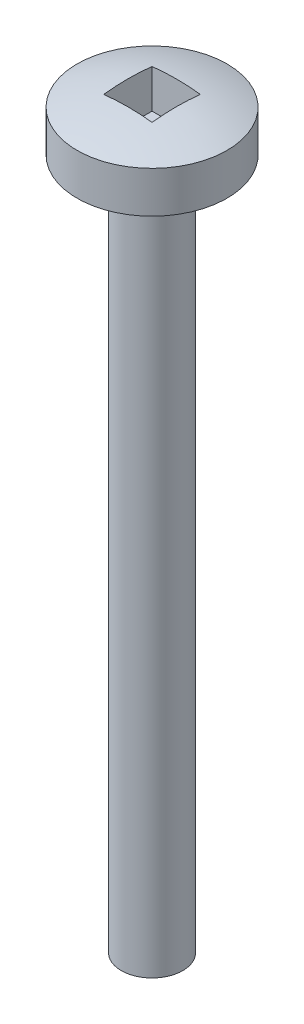
ISO-10303-21;
HEADER;
FILE_DESCRIPTION(('STEP AP214'),'2;1');
FILE_NAME('part.step','',(''),(''),'','','');
FILE_SCHEMA(('AUTOMOTIVE_DESIGN { 1 0 10303 214 1 1 1 1 }'));
ENDSEC;
DATA;
#1=APPLICATION_CONTEXT('core data for automotive mechanical design processes');
#2=APPLICATION_PROTOCOL_DEFINITION('international standard','automotive_design',2000,#1);
#3=PRODUCT_CONTEXT('',#1,'mechanical');
#4=PRODUCT('Part','Part','',(#3));
#5=PRODUCT_RELATED_PRODUCT_CATEGORY('part','',(#4));
#6=PRODUCT_DEFINITION_FORMATION('','',#4);
#7=PRODUCT_DEFINITION_CONTEXT('part definition',#1,'design');
#8=PRODUCT_DEFINITION('design','',#6,#7);
#9=PRODUCT_DEFINITION_SHAPE('','',#8);
#10=(LENGTH_UNIT() NAMED_UNIT(*) SI_UNIT(.MILLI.,.METRE.));
#11=(NAMED_UNIT(*) PLANE_ANGLE_UNIT() SI_UNIT($,.RADIAN.));
#12=(NAMED_UNIT(*) SI_UNIT($,.STERADIAN.) SOLID_ANGLE_UNIT());
#13=UNCERTAINTY_MEASURE_WITH_UNIT(LENGTH_MEASURE(1.E-05),#10,'distance_accuracy_value','');
#14=(GEOMETRIC_REPRESENTATION_CONTEXT(3) GLOBAL_UNCERTAINTY_ASSIGNED_CONTEXT((#13)) GLOBAL_UNIT_ASSIGNED_CONTEXT((#10,
#11,#12)) REPRESENTATION_CONTEXT('',''));
#15=CARTESIAN_POINT('',(0.,0.,0.));
#16=DIRECTION('',(0.,0.,1.));
#17=DIRECTION('',(1.,0.,0.));
#18=AXIS2_PLACEMENT_3D('',#15,#16,#17);
#19=CARTESIAN_POINT('',(0.,-25.4,0.));
#20=DIRECTION('',(0.,1.,0.));
#21=DIRECTION('',(0.,0.,1.));
#22=AXIS2_PLACEMENT_3D('',#19,#20,#21);
#23=CYLINDRICAL_SURFACE('',#22,1.1303);
#24=CARTESIAN_POINT('',(0.,-25.4,0.));
#25=DIRECTION('',(0.,1.,0.));
#26=DIRECTION('',(0.,0.,1.));
#27=AXIS2_PLACEMENT_3D('',#24,#25,#26);
#28=CIRCLE('',#27,1.1303);
#29=CARTESIAN_POINT('',(0.,-25.4,1.1303));
#30=VERTEX_POINT('',#29);
#31=EDGE_CURVE('E105',#30,#30,#28,.T.);
#32=ORIENTED_EDGE('',*,*,#31,.T.);
#33=EDGE_LOOP('',(#32));
#34=FACE_BOUND('',#33,.T.);
#35=CARTESIAN_POINT('',(0.,0.,0.));
#36=DIRECTION('',(0.,1.,0.));
#37=DIRECTION('',(0.,0.,1.));
#38=AXIS2_PLACEMENT_3D('',#35,#36,#37);
#39=CIRCLE('',#38,1.1303);
#40=CARTESIAN_POINT('',(0.,0.,1.1303));
#41=VERTEX_POINT('',#40);
#42=EDGE_CURVE('E109',#41,#41,#39,.T.);
#43=ORIENTED_EDGE('',*,*,#42,.F.);
#44=EDGE_LOOP('',(#43));
#45=FACE_BOUND('',#44,.T.);
#46=ADVANCED_FACE('F33',(#34,#45),#23,.T.);
#47=CARTESIAN_POINT('',(0.,-25.4,0.));
#48=DIRECTION('',(0.,1.,0.));
#49=DIRECTION('',(0.,0.,1.));
#50=AXIS2_PLACEMENT_3D('',#47,#48,#49);
#51=PLANE('',#50);
#52=ORIENTED_EDGE('',*,*,#31,.F.);
#53=EDGE_LOOP('',(#52));
#54=FACE_BOUND('',#53,.T.);
#55=ADVANCED_FACE('F129',(#54),#51,.F.);
#56=CARTESIAN_POINT('',(0.,1.524,0.));
#57=DIRECTION('',(0.,-1.,0.));
#58=DIRECTION('',(0.,0.,-1.));
#59=AXIS2_PLACEMENT_3D('',#56,#57,#58);
#60=CYLINDRICAL_SURFACE('',#59,2.7559);
#61=CARTESIAN_POINT('',(0.,1.524,0.));
#62=DIRECTION('',(0.,1.,0.));
#63=DIRECTION('',(0.,0.,1.));
#64=AXIS2_PLACEMENT_3D('',#61,#62,#63);
#65=CIRCLE('',#64,2.7559);
#66=CARTESIAN_POINT('',(0.,1.524,-2.7559));
#67=VERTEX_POINT('',#66);
#68=EDGE_CURVE('E104',#67,#67,#65,.T.);
#69=CARTESIAN_POINT('',(0.,0.,0.));
#70=DIRECTION('',(0.,1.,0.));
#71=DIRECTION('',(0.,0.,1.));
#72=AXIS2_PLACEMENT_3D('',#69,#70,#71);
#73=CIRCLE('',#72,2.7559);
#74=CARTESIAN_POINT('',(0.,0.,-2.7559));
#75=VERTEX_POINT('',#74);
#76=EDGE_CURVE('E98',#75,#75,#73,.T.);
#77=CARTESIAN_POINT('',(0.,1.524,-2.7559));
#78=CARTESIAN_POINT('',(0.,1.508125,-2.7559));
#79=CARTESIAN_POINT('',(0.,1.49225,-2.7559));
#80=CARTESIAN_POINT('',(0.,1.4605,-2.7559));
#81=CARTESIAN_POINT('',(0.,1.444625,-2.7559));
#82=CARTESIAN_POINT('',(0.,1.412875,-2.7559));
#83=CARTESIAN_POINT('',(0.,1.397,-2.7559));
#84=CARTESIAN_POINT('',(0.,1.36525,-2.7559));
#85=CARTESIAN_POINT('',(0.,1.349375,-2.7559));
#86=CARTESIAN_POINT('',(0.,1.317625,-2.7559));
#87=CARTESIAN_POINT('',(0.,1.30175,-2.7559));
#88=CARTESIAN_POINT('',(0.,1.27,-2.7559));
#89=CARTESIAN_POINT('',(0.,1.254125,-2.7559));
#90=CARTESIAN_POINT('',(0.,1.222375,-2.7559));
#91=CARTESIAN_POINT('',(0.,1.2065,-2.7559));
#92=CARTESIAN_POINT('',(0.,1.17475,-2.7559));
#93=CARTESIAN_POINT('',(0.,1.158875,-2.7559));
#94=CARTESIAN_POINT('',(0.,1.127125,-2.7559));
#95=CARTESIAN_POINT('',(0.,1.11125,-2.7559));
#96=CARTESIAN_POINT('',(0.,1.0795,-2.7559));
#97=CARTESIAN_POINT('',(0.,1.063625,-2.7559));
#98=CARTESIAN_POINT('',(0.,1.031875,-2.7559));
#99=CARTESIAN_POINT('',(0.,1.016,-2.7559));
#100=CARTESIAN_POINT('',(0.,0.98425,-2.7559));
#101=CARTESIAN_POINT('',(0.,0.968375,-2.7559));
#102=CARTESIAN_POINT('',(0.,0.936625,-2.7559));
#103=CARTESIAN_POINT('',(0.,0.92075,-2.7559));
#104=CARTESIAN_POINT('',(0.,0.889,-2.7559));
#105=CARTESIAN_POINT('',(0.,0.873125,-2.7559));
#106=CARTESIAN_POINT('',(0.,0.841375,-2.7559));
#107=CARTESIAN_POINT('',(0.,0.8255,-2.7559));
#108=CARTESIAN_POINT('',(0.,0.79375,-2.7559));
#109=CARTESIAN_POINT('',(0.,0.777875,-2.7559));
#110=CARTESIAN_POINT('',(0.,0.746125,-2.7559));
#111=CARTESIAN_POINT('',(0.,0.73025,-2.7559));
#112=CARTESIAN_POINT('',(0.,0.6985,-2.7559));
#113=CARTESIAN_POINT('',(0.,0.682625,-2.7559));
#114=CARTESIAN_POINT('',(0.,0.650875,-2.7559));
#115=CARTESIAN_POINT('',(0.,0.635,-2.7559));
#116=CARTESIAN_POINT('',(0.,0.60325,-2.7559));
#117=CARTESIAN_POINT('',(0.,0.587375,-2.7559));
#118=CARTESIAN_POINT('',(0.,0.555625,-2.7559));
#119=CARTESIAN_POINT('',(0.,0.53975,-2.7559));
#120=CARTESIAN_POINT('',(0.,0.508,-2.7559));
#121=CARTESIAN_POINT('',(0.,0.492125,-2.7559));
#122=CARTESIAN_POINT('',(0.,0.460375,-2.7559));
#123=CARTESIAN_POINT('',(0.,0.4445,-2.7559));
#124=CARTESIAN_POINT('',(0.,0.41275,-2.7559));
#125=CARTESIAN_POINT('',(0.,0.396875,-2.7559));
#126=CARTESIAN_POINT('',(0.,0.365125,-2.7559));
#127=CARTESIAN_POINT('',(0.,0.34925,-2.7559));
#128=CARTESIAN_POINT('',(0.,0.3175,-2.7559));
#129=CARTESIAN_POINT('',(0.,0.301625,-2.7559));
#130=CARTESIAN_POINT('',(0.,0.269875,-2.7559));
#131=CARTESIAN_POINT('',(0.,0.254,-2.7559));
#132=CARTESIAN_POINT('',(0.,0.22225,-2.7559));
#133=CARTESIAN_POINT('',(0.,0.206375,-2.7559));
#134=CARTESIAN_POINT('',(0.,0.174625,-2.7559));
#135=CARTESIAN_POINT('',(0.,0.15875,-2.7559));
#136=CARTESIAN_POINT('',(0.,0.127,-2.7559));
#137=CARTESIAN_POINT('',(0.,0.111125,-2.7559));
#138=CARTESIAN_POINT('',(0.,0.079375,-2.7559));
#139=CARTESIAN_POINT('',(0.,0.0635,-2.7559));
#140=CARTESIAN_POINT('',(0.,0.0317499999999999,-2.7559));
#141=CARTESIAN_POINT('',(0.,0.015875,-2.7559));
#142=CARTESIAN_POINT('',(0.,0.,-2.7559));
#143=B_SPLINE_CURVE_WITH_KNOTS('',3,(#77,#78,#79,#80,#81,#82,#83,#84,#85,#86,#87,#88,#89,#90,
#91,#92,#93,#94,#95,#96,#97,#98,#99,#100,#101,#102,#103,#104,#105,#106,#107,#108,#109,#110,#111,
#112,#113,#114,#115,#116,#117,#118,#119,#120,#121,#122,#123,#124,#125,#126,#127,#128,#129,#130,
#131,#132,#133,#134,#135,#136,#137,#138,#139,#140,#141,#142),.UNSPECIFIED.,.F.,.F.,(4,2,2,2,2,2,
2,2,2,2,2,2,2,2,2,2,2,2,2,2,2,2,2,2,2,2,2,2,2,2,2,2,4),(0.,0.0476250000000001,
0.0952500000000001,0.142875,0.1905,0.238125,0.28575,0.333375,0.381,0.428625,0.47625,0.523875,
0.5715,0.619125,0.66675,0.714375,0.762,0.809625,0.85725,0.904875,0.9525,1.000125,1.04775,
1.095375,1.143,1.190625,1.23825,1.285875,1.3335,1.381125,1.42875,1.476375,1.524),.UNSPECIFIED.);
#144=EDGE_CURVE('BSEAM124',#67,#75,#143,.T.);
#145=ORIENTED_EDGE('',*,*,#68,.F.);
#146=ORIENTED_EDGE('',*,*,#76,.T.);
#147=ORIENTED_EDGE('',*,*,#144,.T.);
#148=ORIENTED_EDGE('',*,*,#144,.F.);
#149=EDGE_LOOP('',(#145,#147,#146,#148));
#150=FACE_BOUND('',#149,.T.);
#151=ADVANCED_FACE('F124',(#150),#60,.T.);
#152=CARTESIAN_POINT('',(0.,-5.69737875,0.));
#153=DIRECTION('',(0.,0.,1.));
#154=DIRECTION('',(1.,0.,0.));
#155=AXIS2_PLACEMENT_3D('',#152,#153,#154);
#156=SPHERICAL_SURFACE('',#155,7.72937875);
#157=CARTESIAN_POINT('',(0.889,-5.69737875,0.));
#158=DIRECTION('',(1.,0.,0.));
#159=DIRECTION('',(0.,0.,-1.));
#160=AXIS2_PLACEMENT_3D('',#157,#158,#159);
#161=CIRCLE('',#160,7.67808406185759);
#162=CARTESIAN_POINT('',(0.889,1.92906562867028,0.889));
#163=VERTEX_POINT('',#162);
#164=CARTESIAN_POINT('',(0.889,1.92906562867028,-0.889));
#165=VERTEX_POINT('',#164);
#166=EDGE_CURVE('E11',#163,#165,#161,.F.);
#167=ORIENTED_EDGE('',*,*,#166,.F.);
#168=CARTESIAN_POINT('',(0.,-5.69737875,0.889));
#169=DIRECTION('',(0.,0.,1.));
#170=DIRECTION('',(1.,0.,0.));
#171=AXIS2_PLACEMENT_3D('',#168,#169,#170);
#172=CIRCLE('',#171,7.67808406185759);
#173=CARTESIAN_POINT('',(-0.889,1.92906562867028,0.888999999999999));
#174=VERTEX_POINT('',#173);
#175=EDGE_CURVE('E41',#174,#163,#172,.F.);
#176=ORIENTED_EDGE('',*,*,#175,.F.);
#177=CARTESIAN_POINT('',(-0.889,-5.69737875,0.));
#178=DIRECTION('',(-1.,0.,0.));
#179=DIRECTION('',(0.,0.,1.));
#180=AXIS2_PLACEMENT_3D('',#177,#178,#179);
#181=CIRCLE('',#180,7.67808406185759);
#182=CARTESIAN_POINT('',(-0.888999999999999,1.92906562867028,-0.889));
#183=VERTEX_POINT('',#182);
#184=EDGE_CURVE('E115',#183,#174,#181,.F.);
#185=ORIENTED_EDGE('',*,*,#184,.F.);
#186=CARTESIAN_POINT('',(0.,-5.69737875,-0.889));
#187=DIRECTION('',(0.,0.,-1.));
#188=DIRECTION('',(-1.,0.,0.));
#189=AXIS2_PLACEMENT_3D('',#186,#187,#188);
#190=CIRCLE('',#189,7.67808406185759);
#191=EDGE_CURVE('E108',#165,#183,#190,.F.);
#192=ORIENTED_EDGE('',*,*,#191,.F.);
#193=EDGE_LOOP('',(#167,#176,#185,#192));
#194=FACE_BOUND('',#193,.T.);
#195=ORIENTED_EDGE('',*,*,#68,.T.);
#196=EDGE_LOOP('',(#195));
#197=FACE_BOUND('',#196,.T.);
#198=ADVANCED_FACE('F35',(#194,#197),#156,.T.);
#199=CARTESIAN_POINT('',(0.,0.,0.));
#200=DIRECTION('',(0.,1.,0.));
#201=DIRECTION('',(0.,0.,1.));
#202=AXIS2_PLACEMENT_3D('',#199,#200,#201);
#203=PLANE('',#202);
#204=ORIENTED_EDGE('',*,*,#42,.T.);
#205=EDGE_LOOP('',(#204));
#206=FACE_BOUND('',#205,.T.);
#207=ORIENTED_EDGE('',*,*,#76,.F.);
#208=EDGE_LOOP('',(#207));
#209=FACE_BOUND('',#208,.T.);
#210=ADVANCED_FACE('F123',(#206,#209),#203,.F.);
#211=CARTESIAN_POINT('',(0.889,0.508,0.889));
#212=DIRECTION('',(1.,0.,0.));
#213=DIRECTION('',(0.,0.,-1.));
#214=AXIS2_PLACEMENT_3D('',#211,#212,#213);
#215=PLANE('',#214);
#216=ORIENTED_EDGE('',*,*,#166,.T.);
#217=DIRECTION('',(0.,1.,0.));
#218=VECTOR('',#217,1.);
#219=CARTESIAN_POINT('',(0.889,0.508,-0.889));
#220=LINE('',#219,#218);
#221=CARTESIAN_POINT('',(0.889,0.508,-0.889));
#222=VERTEX_POINT('',#221);
#223=EDGE_CURVE('E48',#222,#165,#220,.T.);
#224=ORIENTED_EDGE('',*,*,#223,.F.);
#225=DIRECTION('',(0.,0.,-1.));
#226=VECTOR('',#225,1.);
#227=CARTESIAN_POINT('',(0.889,0.508,0.889));
#228=LINE('',#227,#226);
#229=CARTESIAN_POINT('',(0.889,0.508,0.889));
#230=VERTEX_POINT('',#229);
#231=EDGE_CURVE('E74',#230,#222,#228,.T.);
#232=ORIENTED_EDGE('',*,*,#231,.F.);
#233=DIRECTION('',(0.,1.,0.));
#234=VECTOR('',#233,1.);
#235=CARTESIAN_POINT('',(0.889,0.508,0.889));
#236=LINE('',#235,#234);
#237=EDGE_CURVE('E96',#230,#163,#236,.T.);
#238=ORIENTED_EDGE('',*,*,#237,.T.);
#239=EDGE_LOOP('',(#216,#224,#232,#238));
#240=FACE_BOUND('',#239,.T.);
#241=ADVANCED_FACE('F72',(#240),#215,.F.);
#242=CARTESIAN_POINT('',(-0.889,0.508,0.889));
#243=DIRECTION('',(0.,0.,1.));
#244=DIRECTION('',(1.,0.,0.));
#245=AXIS2_PLACEMENT_3D('',#242,#243,#244);
#246=PLANE('',#245);
#247=ORIENTED_EDGE('',*,*,#175,.T.);
#248=ORIENTED_EDGE('',*,*,#237,.F.);
#249=DIRECTION('',(1.,0.,0.));
#250=VECTOR('',#249,1.);
#251=CARTESIAN_POINT('',(-0.889,0.508,0.889));
#252=LINE('',#251,#250);
#253=CARTESIAN_POINT('',(-0.889,0.508,0.889));
#254=VERTEX_POINT('',#253);
#255=EDGE_CURVE('E79',#254,#230,#252,.T.);
#256=ORIENTED_EDGE('',*,*,#255,.F.);
#257=DIRECTION('',(0.,1.,0.));
#258=VECTOR('',#257,1.);
#259=CARTESIAN_POINT('',(-0.889,0.508,0.889));
#260=LINE('',#259,#258);
#261=EDGE_CURVE('E99',#254,#174,#260,.T.);
#262=ORIENTED_EDGE('',*,*,#261,.T.);
#263=EDGE_LOOP('',(#247,#248,#256,#262));
#264=FACE_BOUND('',#263,.T.);
#265=ADVANCED_FACE('F120',(#264),#246,.F.);
#266=CARTESIAN_POINT('',(-0.889,0.508,0.889));
#267=DIRECTION('',(-1.,0.,0.));
#268=DIRECTION('',(0.,0.,1.));
#269=AXIS2_PLACEMENT_3D('',#266,#267,#268);
#270=PLANE('',#269);
#271=ORIENTED_EDGE('',*,*,#184,.T.);
#272=ORIENTED_EDGE('',*,*,#261,.F.);
#273=DIRECTION('',(0.,0.,1.));
#274=VECTOR('',#273,1.);
#275=CARTESIAN_POINT('',(-0.889,0.508,0.889));
#276=LINE('',#275,#274);
#277=CARTESIAN_POINT('',(-0.889,0.508,-0.889));
#278=VERTEX_POINT('',#277);
#279=EDGE_CURVE('E88',#278,#254,#276,.T.);
#280=ORIENTED_EDGE('',*,*,#279,.F.);
#281=DIRECTION('',(0.,1.,0.));
#282=VECTOR('',#281,1.);
#283=CARTESIAN_POINT('',(-0.889,0.508,-0.889));
#284=LINE('',#283,#282);
#285=EDGE_CURVE('E78',#278,#183,#284,.T.);
#286=ORIENTED_EDGE('',*,*,#285,.T.);
#287=EDGE_LOOP('',(#271,#272,#280,#286));
#288=FACE_BOUND('',#287,.T.);
#289=ADVANCED_FACE('F118',(#288),#270,.F.);
#290=CARTESIAN_POINT('',(-0.889,0.508,-0.889));
#291=DIRECTION('',(0.,0.,-1.));
#292=DIRECTION('',(-1.,0.,0.));
#293=AXIS2_PLACEMENT_3D('',#290,#291,#292);
#294=PLANE('',#293);
#295=ORIENTED_EDGE('',*,*,#191,.T.);
#296=ORIENTED_EDGE('',*,*,#285,.F.);
#297=DIRECTION('',(-1.,0.,0.));
#298=VECTOR('',#297,1.);
#299=CARTESIAN_POINT('',(-0.889,0.508,-0.889));
#300=LINE('',#299,#298);
#301=EDGE_CURVE('E82',#222,#278,#300,.T.);
#302=ORIENTED_EDGE('',*,*,#301,.F.);
#303=ORIENTED_EDGE('',*,*,#223,.T.);
#304=EDGE_LOOP('',(#295,#296,#302,#303));
#305=FACE_BOUND('',#304,.T.);
#306=ADVANCED_FACE('F83',(#305),#294,.F.);
#307=CARTESIAN_POINT('',(0.,0.508,0.));
#308=DIRECTION('',(0.,-1.,0.));
#309=DIRECTION('',(0.,0.,-1.));
#310=AXIS2_PLACEMENT_3D('',#307,#308,#309);
#311=PLANE('',#310);
#312=ORIENTED_EDGE('',*,*,#231,.T.);
#313=ORIENTED_EDGE('',*,*,#301,.T.);
#314=ORIENTED_EDGE('',*,*,#279,.T.);
#315=ORIENTED_EDGE('',*,*,#255,.T.);
#316=EDGE_LOOP('',(#312,#313,#314,#315));
#317=FACE_BOUND('',#316,.T.);
#318=ADVANCED_FACE('F90',(#317),#311,.F.);
#319=CLOSED_SHELL('',(#46,#55,#151,#198,#210,#241,#265,#289,#306,#318));
#320=MANIFOLD_SOLID_BREP('B2',#319);
#321=ADVANCED_BREP_SHAPE_REPRESENTATION('',(#18,#320),#14);
#322=SHAPE_DEFINITION_REPRESENTATION(#9,#321);
ENDSEC;
END-ISO-10303-21;
